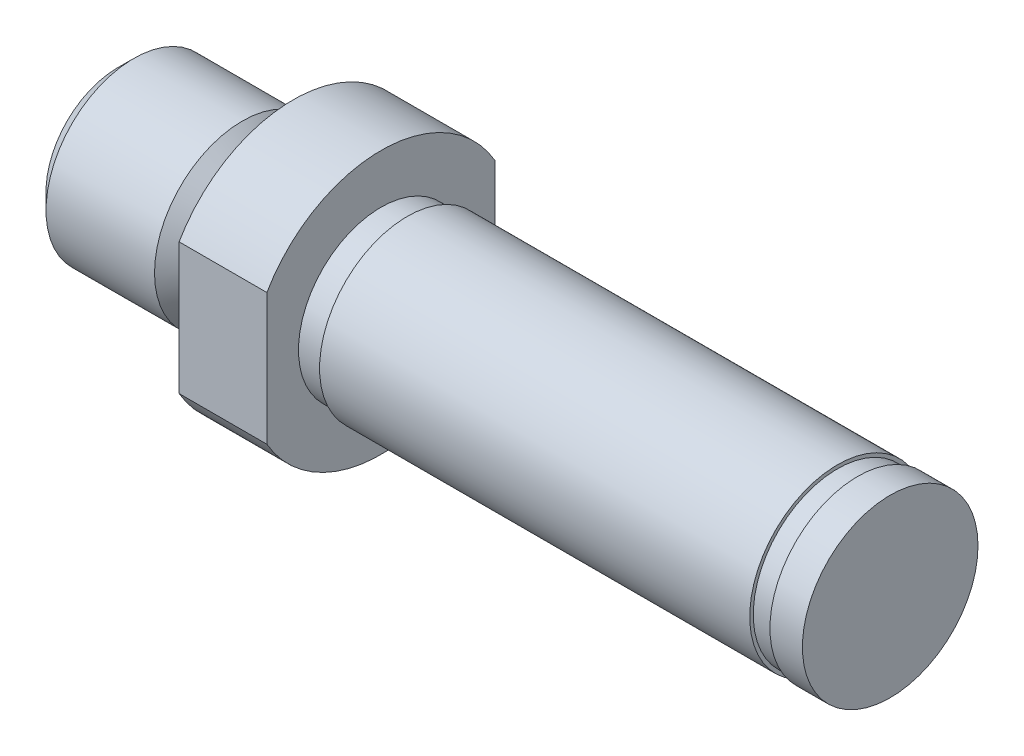
ISO-10303-21;
HEADER;
FILE_DESCRIPTION(('STEP AP214'),'2;1');
FILE_NAME('part.step','',(''),(''),'','','');
FILE_SCHEMA(('AUTOMOTIVE_DESIGN { 1 0 10303 214 1 1 1 1 }'));
ENDSEC;
DATA;
#1=APPLICATION_CONTEXT('core data for automotive mechanical design processes');
#2=APPLICATION_PROTOCOL_DEFINITION('international standard','automotive_design',2000,#1);
#3=PRODUCT_CONTEXT('',#1,'mechanical');
#4=PRODUCT('Part','Part','',(#3));
#5=PRODUCT_RELATED_PRODUCT_CATEGORY('part','',(#4));
#6=PRODUCT_DEFINITION_FORMATION('','',#4);
#7=PRODUCT_DEFINITION_CONTEXT('part definition',#1,'design');
#8=PRODUCT_DEFINITION('design','',#6,#7);
#9=PRODUCT_DEFINITION_SHAPE('','',#8);
#10=(LENGTH_UNIT() NAMED_UNIT(*) SI_UNIT(.MILLI.,.METRE.));
#11=(NAMED_UNIT(*) PLANE_ANGLE_UNIT() SI_UNIT($,.RADIAN.));
#12=(NAMED_UNIT(*) SI_UNIT($,.STERADIAN.) SOLID_ANGLE_UNIT());
#13=UNCERTAINTY_MEASURE_WITH_UNIT(LENGTH_MEASURE(1.E-05),#10,'distance_accuracy_value','');
#14=(GEOMETRIC_REPRESENTATION_CONTEXT(3) GLOBAL_UNCERTAINTY_ASSIGNED_CONTEXT((#13)) GLOBAL_UNIT_ASSIGNED_CONTEXT((#10,
#11,#12)) REPRESENTATION_CONTEXT('',''));
#15=CARTESIAN_POINT('',(0.,0.,0.));
#16=DIRECTION('',(0.,0.,1.));
#17=DIRECTION('',(1.,0.,0.));
#18=AXIS2_PLACEMENT_3D('',#15,#16,#17);
#19=CARTESIAN_POINT('',(0.,2.04,0.));
#20=DIRECTION('',(-1.,0.,0.));
#21=DIRECTION('',(0.,0.,1.));
#22=AXIS2_PLACEMENT_3D('',#19,#20,#21);
#23=PLANE('',#22);
#24=CARTESIAN_POINT('',(0.,0.,0.));
#25=DIRECTION('',(1.,0.,0.));
#26=DIRECTION('',(0.,0.,-1.));
#27=AXIS2_PLACEMENT_3D('',#24,#25,#26);
#28=CIRCLE('',#27,4.08000000010134);
#29=CARTESIAN_POINT('',(0.,0.,-4.08000000010134));
#30=VERTEX_POINT('',#29);
#31=EDGE_CURVE('E152',#30,#30,#28,.T.);
#32=ORIENTED_EDGE('',*,*,#31,.F.);
#33=EDGE_LOOP('',(#32));
#34=FACE_BOUND('',#33,.T.);
#35=ADVANCED_FACE('F17',(#34),#23,.T.);
#36=CARTESIAN_POINT('',(0.91999999995096,0.,0.));
#37=DIRECTION('',(1.,0.,0.));
#38=DIRECTION('',(0.,0.,-1.));
#39=AXIS2_PLACEMENT_3D('',#36,#37,#38);
#40=CONICAL_SURFACE('',#39,5.0000000000523,0.785398163397448);
#41=ORIENTED_EDGE('',*,*,#31,.T.);
#42=EDGE_LOOP('',(#41));
#43=FACE_BOUND('',#42,.T.);
#44=CARTESIAN_POINT('',(0.92,0.,0.));
#45=DIRECTION('',(1.,0.,0.));
#46=DIRECTION('',(0.,0.,-1.));
#47=AXIS2_PLACEMENT_3D('',#44,#45,#46);
#48=CIRCLE('',#47,5.);
#49=CARTESIAN_POINT('',(0.92,0.,-5.));
#50=VERTEX_POINT('',#49);
#51=EDGE_CURVE('E154',#50,#50,#48,.T.);
#52=ORIENTED_EDGE('',*,*,#51,.F.);
#53=EDGE_LOOP('',(#52));
#54=FACE_BOUND('',#53,.T.);
#55=ADVANCED_FACE('F407',(#43,#54),#40,.T.);
#56=CARTESIAN_POINT('',(4.01,0.,0.));
#57=DIRECTION('',(1.,0.,0.));
#58=DIRECTION('',(0.,0.,-1.));
#59=AXIS2_PLACEMENT_3D('',#56,#57,#58);
#60=CYLINDRICAL_SURFACE('',#59,5.);
#61=ORIENTED_EDGE('',*,*,#51,.T.);
#62=EDGE_LOOP('',(#61));
#63=FACE_BOUND('',#62,.T.);
#64=CARTESIAN_POINT('',(7.10000000003674,0.,0.));
#65=DIRECTION('',(-1.,0.,0.));
#66=DIRECTION('',(0.,1.,0.));
#67=AXIS2_PLACEMENT_3D('',#64,#65,#66);
#68=CIRCLE('',#67,4.99999999999545);
#69=CARTESIAN_POINT('',(7.10000000003674,4.99999999999545,0.));
#70=VERTEX_POINT('',#69);
#71=EDGE_CURVE('E165',#70,#70,#68,.F.);
#72=ORIENTED_EDGE('',*,*,#71,.F.);
#73=EDGE_LOOP('',(#72));
#74=FACE_BOUND('',#73,.T.);
#75=ADVANCED_FACE('F397',(#63,#74),#60,.T.);
#76=CARTESIAN_POINT('',(7.10000000009359,0.,0.));
#77=DIRECTION('',(-1.,0.,0.));
#78=DIRECTION('',(0.,0.,1.));
#79=AXIS2_PLACEMENT_3D('',#76,#77,#78);
#80=CONICAL_SURFACE('',#79,4.99999999993861,0.785398163397448);
#81=ORIENTED_EDGE('',*,*,#71,.T.);
#82=EDGE_LOOP('',(#81));
#83=FACE_BOUND('',#82,.T.);
#84=CARTESIAN_POINT('',(7.88284271247462,0.,0.));
#85=DIRECTION('',(-1.,0.,0.));
#86=DIRECTION('',(0.,0.,1.));
#87=AXIS2_PLACEMENT_3D('',#84,#85,#86);
#88=CIRCLE('',#87,4.21715728752538);
#89=CARTESIAN_POINT('',(7.88284271247462,0.,4.21715728752538));
#90=VERTEX_POINT('',#89);
#91=EDGE_CURVE('E170',#90,#90,#88,.T.);
#92=ORIENTED_EDGE('',*,*,#91,.T.);
#93=EDGE_LOOP('',(#92));
#94=FACE_BOUND('',#93,.T.);
#95=ADVANCED_FACE('F387',(#83,#94),#80,.T.);
#96=CARTESIAN_POINT('',(8.16568542494924,0.,0.));
#97=DIRECTION('',(-1.,0.,0.));
#98=DIRECTION('',(0.,0.,1.));
#99=AXIS2_PLACEMENT_3D('',#96,#97,#98);
#100=TOROIDAL_SURFACE('',#99,4.5,0.400000000000005);
#101=CARTESIAN_POINT('',(8.16568542494924,0.,0.));
#102=DIRECTION('',(1.,0.,0.));
#103=DIRECTION('',(0.,0.,-1.));
#104=AXIS2_PLACEMENT_3D('',#101,#102,#103);
#105=CIRCLE('',#104,4.1);
#106=CARTESIAN_POINT('',(8.16568542494924,0.,-4.1));
#107=VERTEX_POINT('',#106);
#108=EDGE_CURVE('E476',#107,#107,#105,.T.);
#109=ORIENTED_EDGE('',*,*,#108,.F.);
#110=EDGE_LOOP('',(#109));
#111=FACE_BOUND('',#110,.T.);
#112=ORIENTED_EDGE('',*,*,#91,.F.);
#113=EDGE_LOOP('',(#112));
#114=FACE_BOUND('',#113,.T.);
#115=ADVANCED_FACE('F378',(#111,#114),#100,.F.);
#116=CARTESIAN_POINT('',(8.88284271247462,0.,0.));
#117=DIRECTION('',(1.,0.,0.));
#118=DIRECTION('',(0.,0.,-1.));
#119=AXIS2_PLACEMENT_3D('',#116,#117,#118);
#120=CYLINDRICAL_SURFACE('',#119,4.1);
#121=ORIENTED_EDGE('',*,*,#108,.T.);
#122=EDGE_LOOP('',(#121));
#123=FACE_BOUND('',#122,.T.);
#124=CARTESIAN_POINT('',(9.6,0.,0.));
#125=DIRECTION('',(-1.,0.,0.));
#126=DIRECTION('',(0.,0.,1.));
#127=AXIS2_PLACEMENT_3D('',#124,#125,#126);
#128=CIRCLE('',#127,4.1);
#129=CARTESIAN_POINT('',(9.6,0.,4.1));
#130=VERTEX_POINT('',#129);
#131=EDGE_CURVE('E83',#130,#130,#128,.T.);
#132=ORIENTED_EDGE('',*,*,#131,.T.);
#133=EDGE_LOOP('',(#132));
#134=FACE_BOUND('',#133,.T.);
#135=ADVANCED_FACE('F370',(#123,#134),#120,.T.);
#136=CARTESIAN_POINT('',(9.6,0.,0.));
#137=DIRECTION('',(-1.,0.,0.));
#138=DIRECTION('',(0.,0.,1.));
#139=AXIS2_PLACEMENT_3D('',#136,#137,#138);
#140=TOROIDAL_SURFACE('',#139,4.5,0.400000000000001);
#141=CARTESIAN_POINT('',(10.,0.,0.));
#142=DIRECTION('',(-1.,0.,0.));
#143=DIRECTION('',(0.,0.,-1.));
#144=AXIS2_PLACEMENT_3D('',#141,#142,#143);
#145=CIRCLE('',#144,4.5);
#146=CARTESIAN_POINT('',(10.,0.,4.5));
#147=VERTEX_POINT('',#146);
#148=CARTESIAN_POINT('',(10.,0.,-4.5));
#149=VERTEX_POINT('',#148);
#150=EDGE_CURVE('E69',#147,#149,#145,.F.);
#151=ORIENTED_EDGE('',*,*,#150,.F.);
#152=CARTESIAN_POINT('',(10.,0.,0.));
#153=DIRECTION('',(-1.,0.,0.));
#154=DIRECTION('',(0.,0.,1.));
#155=AXIS2_PLACEMENT_3D('',#152,#153,#154);
#156=CIRCLE('',#155,4.5);
#157=CARTESIAN_POINT('',(10.,4.5,0.));
#158=VERTEX_POINT('',#157);
#159=EDGE_CURVE('E79',#158,#147,#156,.F.);
#160=ORIENTED_EDGE('',*,*,#159,.F.);
#161=CARTESIAN_POINT('',(10.,0.,0.));
#162=DIRECTION('',(-1.,0.,0.));
#163=DIRECTION('',(0.,1.,0.));
#164=AXIS2_PLACEMENT_3D('',#161,#162,#163);
#165=CIRCLE('',#164,4.5);
#166=EDGE_CURVE('E76',#149,#158,#165,.F.);
#167=ORIENTED_EDGE('',*,*,#166,.F.);
#168=EDGE_LOOP('',(#151,#160,#167));
#169=FACE_BOUND('',#168,.T.);
#170=ORIENTED_EDGE('',*,*,#131,.F.);
#171=EDGE_LOOP('',(#170));
#172=FACE_BOUND('',#171,.T.);
#173=ADVANCED_FACE('F77',(#169,#172),#140,.F.);
#174=CARTESIAN_POINT('',(10.,6.,0.));
#175=DIRECTION('',(-1.,0.,0.));
#176=DIRECTION('',(0.,0.,1.));
#177=AXIS2_PLACEMENT_3D('',#174,#175,#176);
#178=PLANE('',#177);
#179=ORIENTED_EDGE('',*,*,#159,.T.);
#180=ORIENTED_EDGE('',*,*,#150,.T.);
#181=ORIENTED_EDGE('',*,*,#166,.T.);
#182=EDGE_LOOP('',(#179,#180,#181));
#183=FACE_BOUND('',#182,.T.);
#184=CARTESIAN_POINT('',(10.,0.,0.));
#185=DIRECTION('',(1.,0.,0.));
#186=DIRECTION('',(0.,0.,-1.));
#187=AXIS2_PLACEMENT_3D('',#184,#185,#186);
#188=CIRCLE('',#187,7.5);
#189=CARTESIAN_POINT('',(10.,3.74165738677394,-6.5));
#190=VERTEX_POINT('',#189);
#191=CARTESIAN_POINT('',(10.,3.74165738677394,6.5));
#192=VERTEX_POINT('',#191);
#193=EDGE_CURVE('E61',#190,#192,#188,.T.);
#194=ORIENTED_EDGE('',*,*,#193,.F.);
#195=DIRECTION('',(0.,1.,0.));
#196=VECTOR('',#195,1.);
#197=CARTESIAN_POINT('',(10.,15.,-6.5));
#198=LINE('',#197,#196);
#199=CARTESIAN_POINT('',(10.,-3.74165738677394,-6.5));
#200=VERTEX_POINT('',#199);
#201=EDGE_CURVE('E88',#190,#200,#198,.F.);
#202=ORIENTED_EDGE('',*,*,#201,.T.);
#203=CARTESIAN_POINT('',(10.,0.,0.));
#204=DIRECTION('',(1.,0.,0.));
#205=DIRECTION('',(0.,0.,-1.));
#206=AXIS2_PLACEMENT_3D('',#203,#204,#205);
#207=CIRCLE('',#206,7.5);
#208=CARTESIAN_POINT('',(10.,-3.74165738677394,6.5));
#209=VERTEX_POINT('',#208);
#210=EDGE_CURVE('E129',#209,#200,#207,.T.);
#211=ORIENTED_EDGE('',*,*,#210,.F.);
#212=DIRECTION('',(0.,1.,0.));
#213=VECTOR('',#212,1.);
#214=CARTESIAN_POINT('',(10.,15.,6.5));
#215=LINE('',#214,#213);
#216=EDGE_CURVE('E58',#209,#192,#215,.T.);
#217=ORIENTED_EDGE('',*,*,#216,.T.);
#218=EDGE_LOOP('',(#194,#202,#211,#217));
#219=FACE_BOUND('',#218,.T.);
#220=ADVANCED_FACE('F86',(#183,#219),#178,.T.);
#221=CARTESIAN_POINT('',(44.,2.5,0.));
#222=DIRECTION('',(1.,0.,0.));
#223=DIRECTION('',(0.,0.,-1.));
#224=AXIS2_PLACEMENT_3D('',#221,#222,#223);
#225=PLANE('',#224);
#226=CARTESIAN_POINT('',(44.,0.,0.));
#227=DIRECTION('',(1.,0.,0.));
#228=DIRECTION('',(0.,0.,-1.));
#229=AXIS2_PLACEMENT_3D('',#226,#227,#228);
#230=CIRCLE('',#229,5.);
#231=CARTESIAN_POINT('',(44.,0.,-5.));
#232=VERTEX_POINT('',#231);
#233=EDGE_CURVE('E132',#232,#232,#230,.F.);
#234=ORIENTED_EDGE('',*,*,#233,.F.);
#235=EDGE_LOOP('',(#234));
#236=FACE_BOUND('',#235,.T.);
#237=ADVANCED_FACE('F106',(#236),#225,.T.);
#238=CARTESIAN_POINT('',(10.,15.,-6.5));
#239=DIRECTION('',(0.,0.,1.));
#240=DIRECTION('',(1.,0.,0.));
#241=AXIS2_PLACEMENT_3D('',#238,#239,#240);
#242=PLANE('',#241);
#243=DIRECTION('',(0.,1.,0.));
#244=VECTOR('',#243,1.);
#245=CARTESIAN_POINT('',(15.,6.35,-6.5));
#246=LINE('',#245,#244);
#247=CARTESIAN_POINT('',(15.,-3.74165738677394,-6.5));
#248=VERTEX_POINT('',#247);
#249=CARTESIAN_POINT('',(15.,3.74165738677394,-6.5));
#250=VERTEX_POINT('',#249);
#251=EDGE_CURVE('E133',#248,#250,#246,.T.);
#252=ORIENTED_EDGE('',*,*,#251,.F.);
#253=DIRECTION('',(1.,0.,0.));
#254=VECTOR('',#253,1.);
#255=CARTESIAN_POINT('',(12.5,-3.74165738677394,-6.5));
#256=LINE('',#255,#254);
#257=EDGE_CURVE('E130',#200,#248,#256,.T.);
#258=ORIENTED_EDGE('',*,*,#257,.F.);
#259=ORIENTED_EDGE('',*,*,#201,.F.);
#260=DIRECTION('',(1.,0.,0.));
#261=VECTOR('',#260,1.);
#262=CARTESIAN_POINT('',(12.5,3.74165738677394,-6.5));
#263=LINE('',#262,#261);
#264=EDGE_CURVE('E122',#250,#190,#263,.F.);
#265=ORIENTED_EDGE('',*,*,#264,.F.);
#266=EDGE_LOOP('',(#252,#258,#259,#265));
#267=FACE_BOUND('',#266,.T.);
#268=ADVANCED_FACE('F202',(#267),#242,.F.);
#269=CARTESIAN_POINT('',(12.5,0.,0.));
#270=DIRECTION('',(1.,0.,0.));
#271=DIRECTION('',(0.,0.,-1.));
#272=AXIS2_PLACEMENT_3D('',#269,#270,#271);
#273=CYLINDRICAL_SURFACE('',#272,7.5);
#274=DIRECTION('',(-1.,0.,0.));
#275=VECTOR('',#274,1.);
#276=CARTESIAN_POINT('',(15.,3.74165738677394,6.5));
#277=LINE('',#276,#275);
#278=CARTESIAN_POINT('',(15.,3.74165738677394,6.5));
#279=VERTEX_POINT('',#278);
#280=EDGE_CURVE('E125',#192,#279,#277,.F.);
#281=ORIENTED_EDGE('',*,*,#280,.T.);
#282=CARTESIAN_POINT('',(15.,0.,0.));
#283=DIRECTION('',(1.,0.,0.));
#284=DIRECTION('',(0.,0.,-1.));
#285=AXIS2_PLACEMENT_3D('',#282,#283,#284);
#286=CIRCLE('',#285,7.5);
#287=EDGE_CURVE('E136',#250,#279,#286,.T.);
#288=ORIENTED_EDGE('',*,*,#287,.F.);
#289=ORIENTED_EDGE('',*,*,#264,.T.);
#290=ORIENTED_EDGE('',*,*,#193,.T.);
#291=EDGE_LOOP('',(#281,#288,#289,#290));
#292=FACE_BOUND('',#291,.T.);
#293=ADVANCED_FACE('F207',(#292),#273,.T.);
#294=CARTESIAN_POINT('',(15.,15.,6.5));
#295=DIRECTION('',(0.,0.,-1.));
#296=DIRECTION('',(-1.,0.,0.));
#297=AXIS2_PLACEMENT_3D('',#294,#295,#296);
#298=PLANE('',#297);
#299=DIRECTION('',(0.,1.,0.));
#300=VECTOR('',#299,1.);
#301=CARTESIAN_POINT('',(15.,6.35,6.5));
#302=LINE('',#301,#300);
#303=CARTESIAN_POINT('',(15.,-3.74165738677394,6.5));
#304=VERTEX_POINT('',#303);
#305=EDGE_CURVE('E137',#279,#304,#302,.F.);
#306=ORIENTED_EDGE('',*,*,#305,.F.);
#307=ORIENTED_EDGE('',*,*,#280,.F.);
#308=ORIENTED_EDGE('',*,*,#216,.F.);
#309=DIRECTION('',(1.,0.,0.));
#310=VECTOR('',#309,1.);
#311=CARTESIAN_POINT('',(12.5,-3.74165738677394,6.5));
#312=LINE('',#311,#310);
#313=EDGE_CURVE('E127',#304,#209,#312,.F.);
#314=ORIENTED_EDGE('',*,*,#313,.F.);
#315=EDGE_LOOP('',(#306,#307,#308,#314));
#316=FACE_BOUND('',#315,.T.);
#317=ADVANCED_FACE('F240',(#316),#298,.F.);
#318=CARTESIAN_POINT('',(12.5,0.,0.));
#319=DIRECTION('',(1.,0.,0.));
#320=DIRECTION('',(0.,0.,-1.));
#321=AXIS2_PLACEMENT_3D('',#318,#319,#320);
#322=CYLINDRICAL_SURFACE('',#321,7.5);
#323=ORIENTED_EDGE('',*,*,#257,.T.);
#324=CARTESIAN_POINT('',(15.,0.,0.));
#325=DIRECTION('',(1.,0.,0.));
#326=DIRECTION('',(0.,0.,-1.));
#327=AXIS2_PLACEMENT_3D('',#324,#325,#326);
#328=CIRCLE('',#327,7.5);
#329=EDGE_CURVE('E37',#304,#248,#328,.T.);
#330=ORIENTED_EDGE('',*,*,#329,.F.);
#331=ORIENTED_EDGE('',*,*,#313,.T.);
#332=ORIENTED_EDGE('',*,*,#210,.T.);
#333=EDGE_LOOP('',(#323,#330,#331,#332));
#334=FACE_BOUND('',#333,.T.);
#335=ADVANCED_FACE('F197',(#334),#322,.T.);
#336=CARTESIAN_POINT('',(43.075,0.,0.));
#337=DIRECTION('',(1.,0.,0.));
#338=DIRECTION('',(0.,0.,-1.));
#339=AXIS2_PLACEMENT_3D('',#336,#337,#338);
#340=CYLINDRICAL_SURFACE('',#339,5.);
#341=CARTESIAN_POINT('',(42.15,0.,0.));
#342=DIRECTION('',(1.,0.,0.));
#343=DIRECTION('',(0.,0.,-1.));
#344=AXIS2_PLACEMENT_3D('',#341,#342,#343);
#345=CIRCLE('',#344,5.);
#346=CARTESIAN_POINT('',(42.15,0.,-5.));
#347=VERTEX_POINT('',#346);
#348=EDGE_CURVE('E142',#347,#347,#345,.F.);
#349=ORIENTED_EDGE('',*,*,#348,.F.);
#350=EDGE_LOOP('',(#349));
#351=FACE_BOUND('',#350,.T.);
#352=ORIENTED_EDGE('',*,*,#233,.T.);
#353=EDGE_LOOP('',(#352));
#354=FACE_BOUND('',#353,.T.);
#355=ADVANCED_FACE('F193',(#351,#354),#340,.T.);
#356=CARTESIAN_POINT('',(15.,6.35,0.));
#357=DIRECTION('',(1.,0.,0.));
#358=DIRECTION('',(0.,0.,-1.));
#359=AXIS2_PLACEMENT_3D('',#356,#357,#358);
#360=PLANE('',#359);
#361=CARTESIAN_POINT('',(15.,0.,0.));
#362=DIRECTION('',(1.,0.,0.));
#363=DIRECTION('',(0.,0.,-1.));
#364=AXIS2_PLACEMENT_3D('',#361,#362,#363);
#365=CIRCLE('',#364,4.7);
#366=CARTESIAN_POINT('',(15.,0.,-4.7));
#367=VERTEX_POINT('',#366);
#368=EDGE_CURVE('E185',#367,#367,#365,.T.);
#369=ORIENTED_EDGE('',*,*,#368,.F.);
#370=EDGE_LOOP('',(#369));
#371=FACE_BOUND('',#370,.T.);
#372=ORIENTED_EDGE('',*,*,#305,.T.);
#373=ORIENTED_EDGE('',*,*,#329,.T.);
#374=ORIENTED_EDGE('',*,*,#251,.T.);
#375=ORIENTED_EDGE('',*,*,#287,.T.);
#376=EDGE_LOOP('',(#372,#373,#374,#375));
#377=FACE_BOUND('',#376,.T.);
#378=ADVANCED_FACE('F196',(#371,#377),#360,.T.);
#379=CARTESIAN_POINT('',(42.15,4.9,0.));
#380=DIRECTION('',(-1.,0.,0.));
#381=DIRECTION('',(0.,0.,1.));
#382=AXIS2_PLACEMENT_3D('',#379,#380,#381);
#383=PLANE('',#382);
#384=ORIENTED_EDGE('',*,*,#348,.T.);
#385=EDGE_LOOP('',(#384));
#386=FACE_BOUND('',#385,.T.);
#387=CARTESIAN_POINT('',(42.15,0.,0.));
#388=DIRECTION('',(1.,0.,0.));
#389=DIRECTION('',(0.,0.,-1.));
#390=AXIS2_PLACEMENT_3D('',#387,#388,#389);
#391=CIRCLE('',#390,4.8);
#392=CARTESIAN_POINT('',(42.15,0.,-4.8));
#393=VERTEX_POINT('',#392);
#394=EDGE_CURVE('E182',#393,#393,#391,.F.);
#395=ORIENTED_EDGE('',*,*,#394,.F.);
#396=EDGE_LOOP('',(#395));
#397=FACE_BOUND('',#396,.T.);
#398=ADVANCED_FACE('F190',(#386,#397),#383,.T.);
#399=CARTESIAN_POINT('',(15.75,0.,0.));
#400=DIRECTION('',(1.,0.,0.));
#401=DIRECTION('',(0.,0.,-1.));
#402=AXIS2_PLACEMENT_3D('',#399,#400,#401);
#403=CYLINDRICAL_SURFACE('',#402,4.7);
#404=CARTESIAN_POINT('',(16.5,0.,0.));
#405=DIRECTION('',(1.,0.,0.));
#406=DIRECTION('',(0.,0.,-1.));
#407=AXIS2_PLACEMENT_3D('',#404,#405,#406);
#408=CIRCLE('',#407,4.7);
#409=CARTESIAN_POINT('',(16.5,0.,-4.7));
#410=VERTEX_POINT('',#409);
#411=EDGE_CURVE('E179',#410,#410,#408,.F.);
#412=ORIENTED_EDGE('',*,*,#411,.T.);
#413=EDGE_LOOP('',(#412));
#414=FACE_BOUND('',#413,.T.);
#415=ORIENTED_EDGE('',*,*,#368,.T.);
#416=EDGE_LOOP('',(#415));
#417=FACE_BOUND('',#416,.T.);
#418=ADVANCED_FACE('F228',(#414,#417),#403,.T.);
#419=CARTESIAN_POINT('',(41.575,0.,0.));
#420=DIRECTION('',(1.,0.,0.));
#421=DIRECTION('',(0.,0.,-1.));
#422=AXIS2_PLACEMENT_3D('',#419,#420,#421);
#423=CYLINDRICAL_SURFACE('',#422,4.8);
#424=CARTESIAN_POINT('',(41.,0.,0.));
#425=DIRECTION('',(1.,0.,0.));
#426=DIRECTION('',(0.,0.,-1.));
#427=AXIS2_PLACEMENT_3D('',#424,#425,#426);
#428=CIRCLE('',#427,4.8);
#429=CARTESIAN_POINT('',(41.,0.,-4.8));
#430=VERTEX_POINT('',#429);
#431=EDGE_CURVE('E176',#430,#430,#428,.F.);
#432=ORIENTED_EDGE('',*,*,#431,.F.);
#433=EDGE_LOOP('',(#432));
#434=FACE_BOUND('',#433,.T.);
#435=ORIENTED_EDGE('',*,*,#394,.T.);
#436=EDGE_LOOP('',(#435));
#437=FACE_BOUND('',#436,.T.);
#438=ADVANCED_FACE('F224',(#434,#437),#423,.T.);
#439=CARTESIAN_POINT('',(16.5,7.2,0.));
#440=DIRECTION('',(1.,0.,0.));
#441=DIRECTION('',(0.,0.,-1.));
#442=AXIS2_PLACEMENT_3D('',#439,#440,#441);
#443=PLANE('',#442);
#444=ORIENTED_EDGE('',*,*,#411,.F.);
#445=EDGE_LOOP('',(#444));
#446=FACE_BOUND('',#445,.T.);
#447=CARTESIAN_POINT('',(16.5,0.,0.));
#448=DIRECTION('',(1.,0.,0.));
#449=DIRECTION('',(0.,0.,-1.));
#450=AXIS2_PLACEMENT_3D('',#447,#448,#449);
#451=CIRCLE('',#450,5.);
#452=CARTESIAN_POINT('',(16.5,0.,-5.));
#453=VERTEX_POINT('',#452);
#454=EDGE_CURVE('E28',#453,#453,#451,.T.);
#455=ORIENTED_EDGE('',*,*,#454,.F.);
#456=EDGE_LOOP('',(#455));
#457=FACE_BOUND('',#456,.T.);
#458=ADVANCED_FACE('F217',(#446,#457),#443,.F.);
#459=CARTESIAN_POINT('',(41.,4.9,0.));
#460=DIRECTION('',(1.,0.,0.));
#461=DIRECTION('',(0.,0.,-1.));
#462=AXIS2_PLACEMENT_3D('',#459,#460,#461);
#463=PLANE('',#462);
#464=ORIENTED_EDGE('',*,*,#431,.T.);
#465=EDGE_LOOP('',(#464));
#466=FACE_BOUND('',#465,.T.);
#467=CARTESIAN_POINT('',(41.,0.,0.));
#468=DIRECTION('',(1.,0.,0.));
#469=DIRECTION('',(0.,0.,-1.));
#470=AXIS2_PLACEMENT_3D('',#467,#468,#469);
#471=CIRCLE('',#470,5.);
#472=CARTESIAN_POINT('',(41.,0.,-5.));
#473=VERTEX_POINT('',#472);
#474=EDGE_CURVE('E11',#473,#473,#471,.F.);
#475=ORIENTED_EDGE('',*,*,#474,.F.);
#476=EDGE_LOOP('',(#475));
#477=FACE_BOUND('',#476,.T.);
#478=ADVANCED_FACE('F211',(#466,#477),#463,.T.);
#479=CARTESIAN_POINT('',(28.1,0.,0.));
#480=DIRECTION('',(1.,0.,0.));
#481=DIRECTION('',(0.,0.,-1.));
#482=AXIS2_PLACEMENT_3D('',#479,#480,#481);
#483=CYLINDRICAL_SURFACE('',#482,5.);
#484=ORIENTED_EDGE('',*,*,#454,.T.);
#485=EDGE_LOOP('',(#484));
#486=FACE_BOUND('',#485,.T.);
#487=ORIENTED_EDGE('',*,*,#474,.T.);
#488=EDGE_LOOP('',(#487));
#489=FACE_BOUND('',#488,.T.);
#490=ADVANCED_FACE('F209',(#486,#489),#483,.T.);
#491=CLOSED_SHELL('',(#35,#55,#75,#95,#115,#135,#173,#220,#237,#268,#293,#317,#335,#355,#378,
#398,#418,#438,#458,#478,#490));
#492=MANIFOLD_SOLID_BREP('B1',#491);
#493=ADVANCED_BREP_SHAPE_REPRESENTATION('',(#18,#492),#14);
#494=SHAPE_DEFINITION_REPRESENTATION(#9,#493);
ENDSEC;
END-ISO-10303-21;
